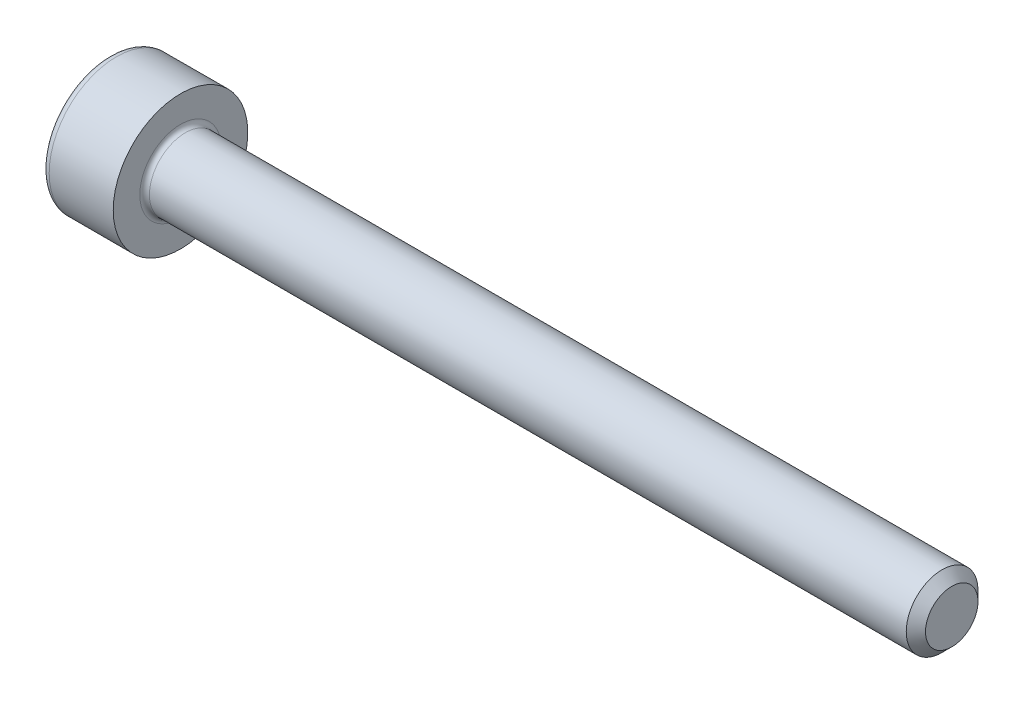
ISO-10303-21;
HEADER;
FILE_DESCRIPTION(('STEP AP214'),'2;1');
FILE_NAME('part.step','',(''),(''),'','','');
FILE_SCHEMA(('AUTOMOTIVE_DESIGN { 1 0 10303 214 1 1 1 1 }'));
ENDSEC;
DATA;
#1=APPLICATION_CONTEXT('core data for automotive mechanical design processes');
#2=APPLICATION_PROTOCOL_DEFINITION('international standard','automotive_design',2000,#1);
#3=PRODUCT_CONTEXT('',#1,'mechanical');
#4=PRODUCT('Part','Part','',(#3));
#5=PRODUCT_RELATED_PRODUCT_CATEGORY('part','',(#4));
#6=PRODUCT_DEFINITION_FORMATION('','',#4);
#7=PRODUCT_DEFINITION_CONTEXT('part definition',#1,'design');
#8=PRODUCT_DEFINITION('design','',#6,#7);
#9=PRODUCT_DEFINITION_SHAPE('','',#8);
#10=(LENGTH_UNIT() NAMED_UNIT(*) SI_UNIT(.MILLI.,.METRE.));
#11=(NAMED_UNIT(*) PLANE_ANGLE_UNIT() SI_UNIT($,.RADIAN.));
#12=(NAMED_UNIT(*) SI_UNIT($,.STERADIAN.) SOLID_ANGLE_UNIT());
#13=UNCERTAINTY_MEASURE_WITH_UNIT(LENGTH_MEASURE(1.E-05),#10,'distance_accuracy_value','');
#14=(GEOMETRIC_REPRESENTATION_CONTEXT(3) GLOBAL_UNCERTAINTY_ASSIGNED_CONTEXT((#13)) GLOBAL_UNIT_ASSIGNED_CONTEXT((#10,
#11,#12)) REPRESENTATION_CONTEXT('',''));
#15=CARTESIAN_POINT('',(0.,0.,0.));
#16=DIRECTION('',(0.,0.,1.));
#17=DIRECTION('',(1.,0.,0.));
#18=AXIS2_PLACEMENT_3D('',#15,#16,#17);
#19=CARTESIAN_POINT('',(0.,0.,0.));
#20=DIRECTION('',(-1.,0.,0.));
#21=DIRECTION('',(0.,0.,1.));
#22=AXIS2_PLACEMENT_3D('',#19,#20,#21);
#23=CYLINDRICAL_SURFACE('',#22,1.39568824458778);
#24=CARTESIAN_POINT('',(0.16,0.,0.));
#25=DIRECTION('',(1.,0.,0.));
#26=DIRECTION('',(0.,0.,-1.));
#27=AXIS2_PLACEMENT_3D('',#24,#25,#26);
#28=CIRCLE('',#27,1.39568824458778);
#29=CARTESIAN_POINT('',(0.16,0.,-1.39568824458778));
#30=VERTEX_POINT('',#29);
#31=EDGE_CURVE('E158',#30,#30,#28,.T.);
#32=ORIENTED_EDGE('',*,*,#31,.T.);
#33=EDGE_LOOP('',(#32));
#34=FACE_BOUND('',#33,.T.);
#35=CARTESIAN_POINT('',(1.48873412756029,0.,0.));
#36=DIRECTION('',(-1.,0.,0.));
#37=DIRECTION('',(0.,0.,1.));
#38=AXIS2_PLACEMENT_3D('',#35,#36,#37);
#39=CIRCLE('',#38,1.39568824458778);
#40=CARTESIAN_POINT('',(1.48873412756029,0.,1.39568824458778));
#41=VERTEX_POINT('',#40);
#42=EDGE_CURVE('E141',#41,#41,#39,.T.);
#43=ORIENTED_EDGE('',*,*,#42,.T.);
#44=EDGE_LOOP('',(#43));
#45=FACE_BOUND('',#44,.T.);
#46=ADVANCED_FACE('F39',(#34,#45),#23,.T.);
#47=CARTESIAN_POINT('',(0.,0.,0.));
#48=DIRECTION('',(1.,0.,0.));
#49=DIRECTION('',(0.,0.,-1.));
#50=AXIS2_PLACEMENT_3D('',#47,#48,#49);
#51=PLANE('',#50);
#52=DIRECTION('',(0.,-0.5,-0.866025403784439));
#53=VECTOR('',#52,1.);
#54=CARTESIAN_POINT('',(0.,0.877572409168232,0.));
#55=LINE('',#54,#53);
#56=CARTESIAN_POINT('',(0.,0.877572409168232,0.));
#57=VERTEX_POINT('',#56);
#58=CARTESIAN_POINT('',(0.,0.438786204584116,-0.760000000000001));
#59=VERTEX_POINT('',#58);
#60=EDGE_CURVE('E128',#57,#59,#55,.T.);
#61=ORIENTED_EDGE('',*,*,#60,.F.);
#62=DIRECTION('',(0.,0.5,-0.866025403784439));
#63=VECTOR('',#62,1.);
#64=CARTESIAN_POINT('',(0.,0.438786204584116,0.76));
#65=LINE('',#64,#63);
#66=CARTESIAN_POINT('',(0.,0.438786204584116,0.76));
#67=VERTEX_POINT('',#66);
#68=EDGE_CURVE('E54',#67,#57,#65,.T.);
#69=ORIENTED_EDGE('',*,*,#68,.F.);
#70=DIRECTION('',(0.,1.,0.));
#71=VECTOR('',#70,1.);
#72=CARTESIAN_POINT('',(0.,-0.438786204584116,0.76));
#73=LINE('',#72,#71);
#74=CARTESIAN_POINT('',(0.,-0.438786204584116,0.76));
#75=VERTEX_POINT('',#74);
#76=EDGE_CURVE('E137',#75,#67,#73,.T.);
#77=ORIENTED_EDGE('',*,*,#76,.F.);
#78=DIRECTION('',(0.,0.5,0.866025403784439));
#79=VECTOR('',#78,1.);
#80=CARTESIAN_POINT('',(0.,-0.877572409168232,0.));
#81=LINE('',#80,#79);
#82=CARTESIAN_POINT('',(0.,-0.877572409168232,0.));
#83=VERTEX_POINT('',#82);
#84=EDGE_CURVE('E135',#83,#75,#81,.T.);
#85=ORIENTED_EDGE('',*,*,#84,.F.);
#86=DIRECTION('',(0.,-0.5,0.866025403784438));
#87=VECTOR('',#86,1.);
#88=CARTESIAN_POINT('',(0.,-0.438786204584116,-0.760000000000001));
#89=LINE('',#88,#87);
#90=CARTESIAN_POINT('',(0.,-0.438786204584116,-0.760000000000001));
#91=VERTEX_POINT('',#90);
#92=EDGE_CURVE('E102',#91,#83,#89,.T.);
#93=ORIENTED_EDGE('',*,*,#92,.F.);
#94=DIRECTION('',(0.,-1.,0.));
#95=VECTOR('',#94,1.);
#96=CARTESIAN_POINT('',(0.,0.438786204584116,-0.760000000000001));
#97=LINE('',#96,#95);
#98=EDGE_CURVE('E131',#59,#91,#97,.T.);
#99=ORIENTED_EDGE('',*,*,#98,.F.);
#100=EDGE_LOOP('',(#61,#69,#77,#85,#93,#99));
#101=FACE_BOUND('',#100,.T.);
#102=CARTESIAN_POINT('',(0.,0.,0.));
#103=DIRECTION('',(1.,0.,0.));
#104=DIRECTION('',(0.,0.,-1.));
#105=AXIS2_PLACEMENT_3D('',#102,#103,#104);
#106=CIRCLE('',#105,1.23568824458778);
#107=CARTESIAN_POINT('',(0.,0.,-1.23568824458778));
#108=VERTEX_POINT('',#107);
#109=EDGE_CURVE('E155',#108,#108,#106,.F.);
#110=ORIENTED_EDGE('',*,*,#109,.T.);
#111=EDGE_LOOP('',(#110));
#112=FACE_BOUND('',#111,.T.);
#113=ADVANCED_FACE('F180',(#101,#112),#51,.F.);
#114=CARTESIAN_POINT('',(17.4887341275603,0.,0.));
#115=DIRECTION('',(-1.,0.,0.));
#116=DIRECTION('',(0.,0.,1.));
#117=AXIS2_PLACEMENT_3D('',#114,#115,#116);
#118=PLANE('',#117);
#119=CARTESIAN_POINT('',(17.4887341275603,0.,0.));
#120=DIRECTION('',(-1.,0.,0.));
#121=DIRECTION('',(0.,0.,1.));
#122=AXIS2_PLACEMENT_3D('',#119,#120,#121);
#123=CIRCLE('',#122,0.544367063780148);
#124=CARTESIAN_POINT('',(17.4887341275603,0.,0.544367063780148));
#125=VERTEX_POINT('',#124);
#126=EDGE_CURVE('E11',#125,#125,#123,.F.);
#127=ORIENTED_EDGE('',*,*,#126,.T.);
#128=EDGE_LOOP('',(#127));
#129=FACE_BOUND('',#128,.T.);
#130=ADVANCED_FACE('F186',(#129),#118,.F.);
#131=CARTESIAN_POINT('',(0.,0.,0.));
#132=DIRECTION('',(-1.,0.,0.));
#133=DIRECTION('',(0.,0.,1.));
#134=AXIS2_PLACEMENT_3D('',#131,#132,#133);
#135=CYLINDRICAL_SURFACE('',#134,0.744367063780147);
#136=CARTESIAN_POINT('',(17.2887341275603,0.,0.));
#137=DIRECTION('',(-1.,0.,0.));
#138=DIRECTION('',(0.,0.,1.));
#139=AXIS2_PLACEMENT_3D('',#136,#137,#138);
#140=CIRCLE('',#139,0.744367063780147);
#141=CARTESIAN_POINT('',(17.2887341275603,0.,0.744367063780147));
#142=VERTEX_POINT('',#141);
#143=EDGE_CURVE('E47',#142,#142,#140,.T.);
#144=ORIENTED_EDGE('',*,*,#143,.T.);
#145=EDGE_LOOP('',(#144));
#146=FACE_BOUND('',#145,.T.);
#147=CARTESIAN_POINT('',(1.58873412756029,0.,0.));
#148=DIRECTION('',(-1.,0.,0.));
#149=DIRECTION('',(0.,0.,1.));
#150=AXIS2_PLACEMENT_3D('',#147,#148,#149);
#151=CIRCLE('',#150,0.744367063780147);
#152=CARTESIAN_POINT('',(1.58873412756029,0.,0.744367063780147));
#153=VERTEX_POINT('',#152);
#154=EDGE_CURVE('E152',#153,#153,#151,.F.);
#155=ORIENTED_EDGE('',*,*,#154,.T.);
#156=EDGE_LOOP('',(#155));
#157=FACE_BOUND('',#156,.T.);
#158=ADVANCED_FACE('F163',(#146,#157),#135,.T.);
#159=CARTESIAN_POINT('',(1.48873412756029,0.,0.));
#160=DIRECTION('',(-1.,0.,0.));
#161=DIRECTION('',(0.,0.,1.));
#162=AXIS2_PLACEMENT_3D('',#159,#160,#161);
#163=PLANE('',#162);
#164=CARTESIAN_POINT('',(1.48873412756029,0.,0.));
#165=DIRECTION('',(-1.,0.,0.));
#166=DIRECTION('',(0.,0.,1.));
#167=AXIS2_PLACEMENT_3D('',#164,#165,#166);
#168=CIRCLE('',#167,0.844367063780148);
#169=CARTESIAN_POINT('',(1.48873412756029,0.,0.844367063780148));
#170=VERTEX_POINT('',#169);
#171=EDGE_CURVE('E149',#170,#170,#168,.T.);
#172=ORIENTED_EDGE('',*,*,#171,.T.);
#173=EDGE_LOOP('',(#172));
#174=FACE_BOUND('',#173,.T.);
#175=ORIENTED_EDGE('',*,*,#42,.F.);
#176=EDGE_LOOP('',(#175));
#177=FACE_BOUND('',#176,.T.);
#178=ADVANCED_FACE('F193',(#174,#177),#163,.F.);
#179=CARTESIAN_POINT('',(1.58873412756029,0.,0.));
#180=DIRECTION('',(-1.,0.,0.));
#181=DIRECTION('',(0.,0.,1.));
#182=AXIS2_PLACEMENT_3D('',#179,#180,#181);
#183=TOROIDAL_SURFACE('',#182,0.844367063780148,0.1);
#184=ORIENTED_EDGE('',*,*,#154,.F.);
#185=EDGE_LOOP('',(#184));
#186=FACE_BOUND('',#185,.T.);
#187=ORIENTED_EDGE('',*,*,#171,.F.);
#188=EDGE_LOOP('',(#187));
#189=FACE_BOUND('',#188,.T.);
#190=ADVANCED_FACE('F176',(#186,#189),#183,.F.);
#191=CARTESIAN_POINT('',(0.16,0.,0.));
#192=DIRECTION('',(1.,0.,0.));
#193=DIRECTION('',(0.,0.,-1.));
#194=AXIS2_PLACEMENT_3D('',#191,#192,#193);
#195=TOROIDAL_SURFACE('',#194,1.23568824458778,0.16);
#196=ORIENTED_EDGE('',*,*,#31,.F.);
#197=EDGE_LOOP('',(#196));
#198=FACE_BOUND('',#197,.T.);
#199=ORIENTED_EDGE('',*,*,#109,.F.);
#200=EDGE_LOOP('',(#199));
#201=FACE_BOUND('',#200,.T.);
#202=ADVANCED_FACE('F168',(#198,#201),#195,.T.);
#203=CARTESIAN_POINT('',(17.2887341275603,0.,0.));
#204=DIRECTION('',(-1.,0.,0.));
#205=DIRECTION('',(0.,0.,1.));
#206=AXIS2_PLACEMENT_3D('',#203,#204,#205);
#207=CONICAL_SURFACE('',#206,0.744367063780147,0.785398163397449);
#208=ORIENTED_EDGE('',*,*,#126,.F.);
#209=EDGE_LOOP('',(#208));
#210=FACE_BOUND('',#209,.T.);
#211=ORIENTED_EDGE('',*,*,#143,.F.);
#212=EDGE_LOOP('',(#211));
#213=FACE_BOUND('',#212,.T.);
#214=ADVANCED_FACE('F41',(#210,#213),#207,.T.);
#215=CARTESIAN_POINT('',(0.7,0.438786204584116,0.76));
#216=DIRECTION('',(0.,0.866025403784439,0.5));
#217=DIRECTION('',(0.,-0.5,0.866025403784439));
#218=AXIS2_PLACEMENT_3D('',#215,#216,#217);
#219=PLANE('',#218);
#220=ORIENTED_EDGE('',*,*,#68,.T.);
#221=DIRECTION('',(-1.,0.,0.));
#222=VECTOR('',#221,1.);
#223=CARTESIAN_POINT('',(0.7,0.877572409168232,0.));
#224=LINE('',#223,#222);
#225=CARTESIAN_POINT('',(0.7,0.877572409168232,0.));
#226=VERTEX_POINT('',#225);
#227=EDGE_CURVE('E84',#226,#57,#224,.T.);
#228=ORIENTED_EDGE('',*,*,#227,.F.);
#229=DIRECTION('',(0.,0.5,-0.866025403784439));
#230=VECTOR('',#229,1.);
#231=CARTESIAN_POINT('',(0.7,0.438786204584116,0.76));
#232=LINE('',#231,#230);
#233=CARTESIAN_POINT('',(0.7,0.438786204584116,0.76));
#234=VERTEX_POINT('',#233);
#235=EDGE_CURVE('E139',#234,#226,#232,.T.);
#236=ORIENTED_EDGE('',*,*,#235,.F.);
#237=DIRECTION('',(-1.,0.,0.));
#238=VECTOR('',#237,1.);
#239=CARTESIAN_POINT('',(0.7,0.438786204584116,0.76));
#240=LINE('',#239,#238);
#241=EDGE_CURVE('E62',#234,#67,#240,.T.);
#242=ORIENTED_EDGE('',*,*,#241,.T.);
#243=EDGE_LOOP('',(#220,#228,#236,#242));
#244=FACE_BOUND('',#243,.T.);
#245=ADVANCED_FACE('F167',(#244),#219,.F.);
#246=CARTESIAN_POINT('',(0.7,-0.438786204584116,0.76));
#247=DIRECTION('',(0.,0.,1.));
#248=DIRECTION('',(1.,0.,0.));
#249=AXIS2_PLACEMENT_3D('',#246,#247,#248);
#250=PLANE('',#249);
#251=ORIENTED_EDGE('',*,*,#76,.T.);
#252=ORIENTED_EDGE('',*,*,#241,.F.);
#253=DIRECTION('',(0.,1.,0.));
#254=VECTOR('',#253,1.);
#255=CARTESIAN_POINT('',(0.7,-0.438786204584116,0.76));
#256=LINE('',#255,#254);
#257=CARTESIAN_POINT('',(0.7,-0.438786204584116,0.76));
#258=VERTEX_POINT('',#257);
#259=EDGE_CURVE('E114',#258,#234,#256,.T.);
#260=ORIENTED_EDGE('',*,*,#259,.F.);
#261=DIRECTION('',(-1.,0.,0.));
#262=VECTOR('',#261,1.);
#263=CARTESIAN_POINT('',(0.7,-0.438786204584116,0.76));
#264=LINE('',#263,#262);
#265=EDGE_CURVE('E106',#258,#75,#264,.T.);
#266=ORIENTED_EDGE('',*,*,#265,.T.);
#267=EDGE_LOOP('',(#251,#252,#260,#266));
#268=FACE_BOUND('',#267,.T.);
#269=ADVANCED_FACE('F174',(#268),#250,.F.);
#270=CARTESIAN_POINT('',(0.7,-0.877572409168232,0.));
#271=DIRECTION('',(0.,-0.866025403784439,0.5));
#272=DIRECTION('',(0.,-0.5,-0.866025403784439));
#273=AXIS2_PLACEMENT_3D('',#270,#271,#272);
#274=PLANE('',#273);
#275=ORIENTED_EDGE('',*,*,#84,.T.);
#276=ORIENTED_EDGE('',*,*,#265,.F.);
#277=DIRECTION('',(0.,0.5,0.866025403784439));
#278=VECTOR('',#277,1.);
#279=CARTESIAN_POINT('',(0.7,-0.877572409168232,0.));
#280=LINE('',#279,#278);
#281=CARTESIAN_POINT('',(0.7,-0.877572409168232,0.));
#282=VERTEX_POINT('',#281);
#283=EDGE_CURVE('E110',#282,#258,#280,.T.);
#284=ORIENTED_EDGE('',*,*,#283,.F.);
#285=DIRECTION('',(-1.,0.,0.));
#286=VECTOR('',#285,1.);
#287=CARTESIAN_POINT('',(0.7,-0.877572409168232,0.));
#288=LINE('',#287,#286);
#289=EDGE_CURVE('E95',#282,#83,#288,.T.);
#290=ORIENTED_EDGE('',*,*,#289,.T.);
#291=EDGE_LOOP('',(#275,#276,#284,#290));
#292=FACE_BOUND('',#291,.T.);
#293=ADVANCED_FACE('F111',(#292),#274,.F.);
#294=CARTESIAN_POINT('',(0.7,-0.438786204584116,-0.760000000000001));
#295=DIRECTION('',(0.,-0.866025403784438,-0.5));
#296=DIRECTION('',(0.,0.5,-0.866025403784438));
#297=AXIS2_PLACEMENT_3D('',#294,#295,#296);
#298=PLANE('',#297);
#299=ORIENTED_EDGE('',*,*,#92,.T.);
#300=ORIENTED_EDGE('',*,*,#289,.F.);
#301=DIRECTION('',(0.,-0.5,0.866025403784438));
#302=VECTOR('',#301,1.);
#303=CARTESIAN_POINT('',(0.7,-0.438786204584116,-0.760000000000001));
#304=LINE('',#303,#302);
#305=CARTESIAN_POINT('',(0.7,-0.438786204584116,-0.760000000000001));
#306=VERTEX_POINT('',#305);
#307=EDGE_CURVE('E99',#306,#282,#304,.T.);
#308=ORIENTED_EDGE('',*,*,#307,.F.);
#309=DIRECTION('',(-1.,0.,0.));
#310=VECTOR('',#309,1.);
#311=CARTESIAN_POINT('',(0.7,-0.438786204584116,-0.760000000000001));
#312=LINE('',#311,#310);
#313=EDGE_CURVE('E107',#306,#91,#312,.T.);
#314=ORIENTED_EDGE('',*,*,#313,.T.);
#315=EDGE_LOOP('',(#299,#300,#308,#314));
#316=FACE_BOUND('',#315,.T.);
#317=ADVANCED_FACE('F97',(#316),#298,.F.);
#318=CARTESIAN_POINT('',(0.7,0.438786204584116,-0.760000000000001));
#319=DIRECTION('',(0.,0.,-1.));
#320=DIRECTION('',(0.,1.,0.));
#321=AXIS2_PLACEMENT_3D('',#318,#319,#320);
#322=PLANE('',#321);
#323=ORIENTED_EDGE('',*,*,#98,.T.);
#324=ORIENTED_EDGE('',*,*,#313,.F.);
#325=DIRECTION('',(0.,-1.,0.));
#326=VECTOR('',#325,1.);
#327=CARTESIAN_POINT('',(0.7,0.438786204584116,-0.760000000000001));
#328=LINE('',#327,#326);
#329=CARTESIAN_POINT('',(0.7,0.438786204584116,-0.760000000000001));
#330=VERTEX_POINT('',#329);
#331=EDGE_CURVE('E120',#330,#306,#328,.T.);
#332=ORIENTED_EDGE('',*,*,#331,.F.);
#333=DIRECTION('',(-1.,0.,0.));
#334=VECTOR('',#333,1.);
#335=CARTESIAN_POINT('',(0.7,0.438786204584116,-0.760000000000001));
#336=LINE('',#335,#334);
#337=EDGE_CURVE('E144',#330,#59,#336,.T.);
#338=ORIENTED_EDGE('',*,*,#337,.T.);
#339=EDGE_LOOP('',(#323,#324,#332,#338));
#340=FACE_BOUND('',#339,.T.);
#341=ADVANCED_FACE('F215',(#340),#322,.F.);
#342=CARTESIAN_POINT('',(0.7,0.877572409168232,0.));
#343=DIRECTION('',(0.,0.866025403784439,-0.5));
#344=DIRECTION('',(0.,0.5,0.866025403784439));
#345=AXIS2_PLACEMENT_3D('',#342,#343,#344);
#346=PLANE('',#345);
#347=ORIENTED_EDGE('',*,*,#60,.T.);
#348=ORIENTED_EDGE('',*,*,#337,.F.);
#349=DIRECTION('',(0.,-0.5,-0.866025403784439));
#350=VECTOR('',#349,1.);
#351=CARTESIAN_POINT('',(0.7,0.877572409168232,0.));
#352=LINE('',#351,#350);
#353=EDGE_CURVE('E122',#226,#330,#352,.T.);
#354=ORIENTED_EDGE('',*,*,#353,.F.);
#355=ORIENTED_EDGE('',*,*,#227,.T.);
#356=EDGE_LOOP('',(#347,#348,#354,#355));
#357=FACE_BOUND('',#356,.T.);
#358=ADVANCED_FACE('F212',(#357),#346,.F.);
#359=CARTESIAN_POINT('',(0.7,0.,0.));
#360=DIRECTION('',(-1.,0.,0.));
#361=DIRECTION('',(0.,0.,1.));
#362=AXIS2_PLACEMENT_3D('',#359,#360,#361);
#363=PLANE('',#362);
#364=ORIENTED_EDGE('',*,*,#235,.T.);
#365=ORIENTED_EDGE('',*,*,#353,.T.);
#366=ORIENTED_EDGE('',*,*,#331,.T.);
#367=ORIENTED_EDGE('',*,*,#307,.T.);
#368=ORIENTED_EDGE('',*,*,#283,.T.);
#369=ORIENTED_EDGE('',*,*,#259,.T.);
#370=EDGE_LOOP('',(#364,#365,#366,#367,#368,#369));
#371=FACE_BOUND('',#370,.T.);
#372=ADVANCED_FACE('F117',(#371),#363,.T.);
#373=CLOSED_SHELL('',(#46,#113,#130,#158,#178,#190,#202,#214,#245,#269,#293,#317,#341,#358,#372));
#374=MANIFOLD_SOLID_BREP('B2',#373);
#375=ADVANCED_BREP_SHAPE_REPRESENTATION('',(#18,#374),#14);
#376=SHAPE_DEFINITION_REPRESENTATION(#9,#375);
ENDSEC;
END-ISO-10303-21;
